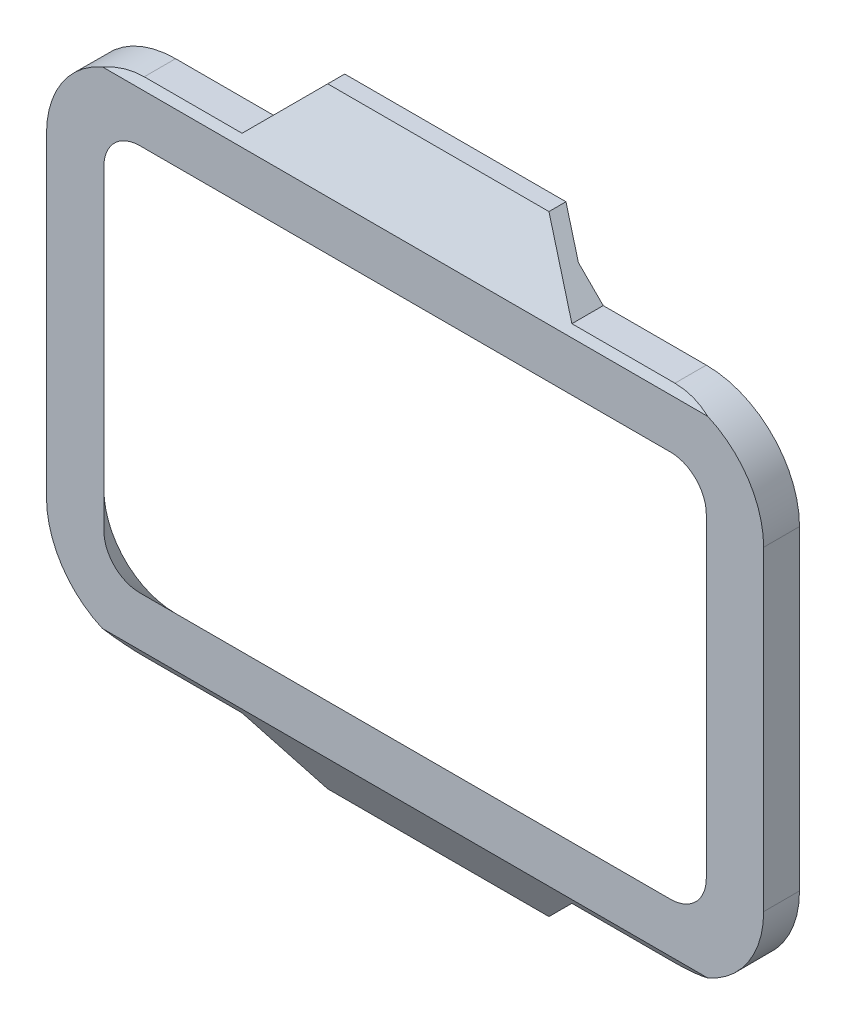
ISO-10303-21;
HEADER;
FILE_DESCRIPTION(('STEP AP214'),'2;1');
FILE_NAME('part.step','',(''),(''),'','','');
FILE_SCHEMA(('AUTOMOTIVE_DESIGN { 1 0 10303 214 1 1 1 1 }'));
ENDSEC;
DATA;
#1=APPLICATION_CONTEXT('core data for automotive mechanical design processes');
#2=APPLICATION_PROTOCOL_DEFINITION('international standard','automotive_design',2000,#1);
#3=PRODUCT_CONTEXT('',#1,'mechanical');
#4=PRODUCT('Part','Part','',(#3));
#5=PRODUCT_RELATED_PRODUCT_CATEGORY('part','',(#4));
#6=PRODUCT_DEFINITION_FORMATION('','',#4);
#7=PRODUCT_DEFINITION_CONTEXT('part definition',#1,'design');
#8=PRODUCT_DEFINITION('design','',#6,#7);
#9=PRODUCT_DEFINITION_SHAPE('','',#8);
#10=(LENGTH_UNIT() NAMED_UNIT(*) SI_UNIT(.MILLI.,.METRE.));
#11=(NAMED_UNIT(*) PLANE_ANGLE_UNIT() SI_UNIT($,.RADIAN.));
#12=(NAMED_UNIT(*) SI_UNIT($,.STERADIAN.) SOLID_ANGLE_UNIT());
#13=UNCERTAINTY_MEASURE_WITH_UNIT(LENGTH_MEASURE(1.E-05),#10,'distance_accuracy_value','');
#14=(GEOMETRIC_REPRESENTATION_CONTEXT(3) GLOBAL_UNCERTAINTY_ASSIGNED_CONTEXT((#13)) GLOBAL_UNIT_ASSIGNED_CONTEXT((#10,
#11,#12)) REPRESENTATION_CONTEXT('',''));
#15=CARTESIAN_POINT('',(0.,0.,0.));
#16=DIRECTION('',(0.,0.,1.));
#17=DIRECTION('',(1.,0.,0.));
#18=AXIS2_PLACEMENT_3D('',#15,#16,#17);
#19=CARTESIAN_POINT('',(0.,-88.0986851236343,-5.));
#20=DIRECTION('',(0.,-1.,0.));
#21=DIRECTION('',(0.,0.,-1.));
#22=AXIS2_PLACEMENT_3D('',#19,#20,#21);
#23=PLANE('',#22);
#24=DIRECTION('',(0.,0.,1.));
#25=VECTOR('',#24,1.);
#26=CARTESIAN_POINT('',(45.0115613829762,-88.0986851236343,-5.));
#27=LINE('',#26,#25);
#28=CARTESIAN_POINT('',(45.0115613829762,-88.0986851236343,-5.));
#29=VERTEX_POINT('',#28);
#30=CARTESIAN_POINT('',(45.0115613829762,-88.0986851236343,-0.628851162176113));
#31=VERTEX_POINT('',#30);
#32=EDGE_CURVE('E325',#29,#31,#27,.T.);
#33=ORIENTED_EDGE('',*,*,#32,.T.);
#34=DIRECTION('',(-1.,0.,0.));
#35=VECTOR('',#34,1.);
#36=CARTESIAN_POINT('',(0.,-88.0986851236343,-0.628851162176109));
#37=LINE('',#36,#35);
#38=CARTESIAN_POINT('',(30.6444252788379,-88.0986851236343,-0.628851162176112));
#39=VERTEX_POINT('',#38);
#40=EDGE_CURVE('E48',#31,#39,#37,.T.);
#41=ORIENTED_EDGE('',*,*,#40,.T.);
#42=DIRECTION('',(0.,0.,1.));
#43=VECTOR('',#42,1.);
#44=CARTESIAN_POINT('',(30.6444252788379,-88.0986851236343,-8.));
#45=LINE('',#44,#43);
#46=CARTESIAN_POINT('',(30.6444252788379,-88.0986851236343,-5.));
#47=VERTEX_POINT('',#46);
#48=EDGE_CURVE('E223',#47,#39,#45,.T.);
#49=ORIENTED_EDGE('',*,*,#48,.F.);
#50=DIRECTION('',(1.,0.,0.));
#51=VECTOR('',#50,1.);
#52=CARTESIAN_POINT('',(0.,-88.0986851236343,-5.));
#53=LINE('',#52,#51);
#54=EDGE_CURVE('E233',#47,#29,#53,.T.);
#55=ORIENTED_EDGE('',*,*,#54,.T.);
#56=EDGE_LOOP('',(#33,#41,#49,#55));
#57=FACE_BOUND('',#56,.T.);
#58=ADVANCED_FACE('F38',(#57),#23,.T.);
#59=DIRECTION('',(0.,0.,1.));
#60=VECTOR('',#59,1.);
#61=CARTESIAN_POINT('',(-15.345428915665,-88.0986851236343,-8.));
#62=LINE('',#61,#60);
#63=CARTESIAN_POINT('',(-15.345428915665,-88.0986851236343,-5.));
#64=VERTEX_POINT('',#63);
#65=CARTESIAN_POINT('',(-15.345428915665,-88.0986851236343,-0.628851162176108));
#66=VERTEX_POINT('',#65);
#67=EDGE_CURVE('E436',#64,#66,#62,.T.);
#68=ORIENTED_EDGE('',*,*,#67,.T.);
#69=DIRECTION('',(-1.,0.,0.));
#70=VECTOR('',#69,1.);
#71=CARTESIAN_POINT('',(0.,-88.0986851236343,-0.628851162176109));
#72=LINE('',#71,#70);
#73=CARTESIAN_POINT('',(-28.9884386170237,-88.0986851236343,-0.628851162176106));
#74=VERTEX_POINT('',#73);
#75=EDGE_CURVE('E414',#66,#74,#72,.T.);
#76=ORIENTED_EDGE('',*,*,#75,.T.);
#77=DIRECTION('',(0.,0.,1.));
#78=VECTOR('',#77,1.);
#79=CARTESIAN_POINT('',(-28.9884386170237,-88.0986851236343,-5.));
#80=LINE('',#79,#78);
#81=CARTESIAN_POINT('',(-28.9884386170237,-88.0986851236343,-5.));
#82=VERTEX_POINT('',#81);
#83=EDGE_CURVE('E327',#82,#74,#80,.T.);
#84=ORIENTED_EDGE('',*,*,#83,.F.);
#85=EDGE_CURVE('E245',#82,#64,#53,.T.);
#86=ORIENTED_EDGE('',*,*,#85,.T.);
#87=EDGE_LOOP('',(#68,#76,#84,#86));
#88=FACE_BOUND('',#87,.T.);
#89=ADVANCED_FACE('F505',(#88),#23,.T.);
#90=CARTESIAN_POINT('',(0.,-18.0986851236343,-5.));
#91=DIRECTION('',(0.,1.,0.));
#92=DIRECTION('',(-1.,0.,0.));
#93=AXIS2_PLACEMENT_3D('',#90,#91,#92);
#94=PLANE('',#93);
#95=DIRECTION('',(0.,0.,1.));
#96=VECTOR('',#95,1.);
#97=CARTESIAN_POINT('',(-28.9884386170237,-18.0986851236343,-5.));
#98=LINE('',#97,#96);
#99=CARTESIAN_POINT('',(-28.9884386170237,-18.0986851236343,-5.));
#100=VERTEX_POINT('',#99);
#101=CARTESIAN_POINT('',(-28.9884386170237,-18.0986851236343,-0.628851162176097));
#102=VERTEX_POINT('',#101);
#103=EDGE_CURVE('E314',#100,#102,#98,.T.);
#104=ORIENTED_EDGE('',*,*,#103,.T.);
#105=DIRECTION('',(-1.,0.,0.));
#106=VECTOR('',#105,1.);
#107=CARTESIAN_POINT('',(0.,-18.0986851236343,-0.628851162176101));
#108=LINE('',#107,#106);
#109=CARTESIAN_POINT('',(-15.345428915665,-18.0986851236343,-0.628851162176099));
#110=VERTEX_POINT('',#109);
#111=EDGE_CURVE('E392',#102,#110,#108,.F.);
#112=ORIENTED_EDGE('',*,*,#111,.T.);
#113=DIRECTION('',(0.,0.,1.));
#114=VECTOR('',#113,1.);
#115=CARTESIAN_POINT('',(-15.345428915665,-18.0986851236343,-8.));
#116=LINE('',#115,#114);
#117=CARTESIAN_POINT('',(-15.345428915665,-18.0986851236343,-5.));
#118=VERTEX_POINT('',#117);
#119=EDGE_CURVE('E351',#118,#110,#116,.T.);
#120=ORIENTED_EDGE('',*,*,#119,.F.);
#121=DIRECTION('',(-1.,0.,0.));
#122=VECTOR('',#121,1.);
#123=CARTESIAN_POINT('',(0.,-18.0986851236343,-5.));
#124=LINE('',#123,#122);
#125=EDGE_CURVE('E261',#118,#100,#124,.T.);
#126=ORIENTED_EDGE('',*,*,#125,.T.);
#127=EDGE_LOOP('',(#104,#112,#120,#126));
#128=FACE_BOUND('',#127,.T.);
#129=ADVANCED_FACE('F464',(#128),#94,.T.);
#130=CARTESIAN_POINT('',(-41.9884386170237,0.,-5.));
#131=DIRECTION('',(-1.,0.,0.));
#132=DIRECTION('',(0.,0.,1.));
#133=AXIS2_PLACEMENT_3D('',#130,#131,#132);
#134=PLANE('',#133);
#135=DIRECTION('',(0.,-1.,0.));
#136=VECTOR('',#135,1.);
#137=CARTESIAN_POINT('',(-41.9884386170237,0.,0.));
#138=LINE('',#137,#136);
#139=CARTESIAN_POINT('',(-41.9884386170237,-31.0986851236343,0.));
#140=VERTEX_POINT('',#139);
#141=CARTESIAN_POINT('',(-41.9884386170237,-75.0986851236343,0.));
#142=VERTEX_POINT('',#141);
#143=EDGE_CURVE('E294',#140,#142,#138,.T.);
#144=ORIENTED_EDGE('',*,*,#143,.F.);
#145=DIRECTION('',(0.,0.,1.));
#146=VECTOR('',#145,1.);
#147=CARTESIAN_POINT('',(-41.9884386170237,-31.0986851236343,-5.));
#148=LINE('',#147,#146);
#149=CARTESIAN_POINT('',(-41.9884386170237,-31.0986851236343,-5.));
#150=VERTEX_POINT('',#149);
#151=EDGE_CURVE('E310',#150,#140,#148,.T.);
#152=ORIENTED_EDGE('',*,*,#151,.F.);
#153=DIRECTION('',(0.,-1.,0.));
#154=VECTOR('',#153,1.);
#155=CARTESIAN_POINT('',(-41.9884386170237,0.,-5.));
#156=LINE('',#155,#154);
#157=CARTESIAN_POINT('',(-41.9884386170237,-75.0986851236343,-5.));
#158=VERTEX_POINT('',#157);
#159=EDGE_CURVE('E250',#150,#158,#156,.T.);
#160=ORIENTED_EDGE('',*,*,#159,.T.);
#161=DIRECTION('',(0.,0.,1.));
#162=VECTOR('',#161,1.);
#163=CARTESIAN_POINT('',(-41.9884386170237,-75.0986851236343,-5.));
#164=LINE('',#163,#162);
#165=EDGE_CURVE('E268',#158,#142,#164,.T.);
#166=ORIENTED_EDGE('',*,*,#165,.T.);
#167=EDGE_LOOP('',(#144,#152,#160,#166));
#168=FACE_BOUND('',#167,.T.);
#169=ADVANCED_FACE('F453',(#168),#134,.T.);
#170=CARTESIAN_POINT('',(-28.9884386170237,-31.0986851236343,-5.));
#171=DIRECTION('',(0.,0.,1.));
#172=DIRECTION('',(1.,0.,0.));
#173=AXIS2_PLACEMENT_3D('',#170,#171,#172);
#174=CYLINDRICAL_SURFACE('',#173,13.);
#175=CARTESIAN_POINT('',(-28.9884386170237,-31.0986851236343,0.));
#176=DIRECTION('',(0.,0.,1.));
#177=DIRECTION('',(1.,0.,0.));
#178=AXIS2_PLACEMENT_3D('',#175,#176,#177);
#179=CIRCLE('',#178,13.);
#180=CARTESIAN_POINT('',(-34.1973631598608,-19.1878872869221,0.));
#181=VERTEX_POINT('',#180);
#182=EDGE_CURVE('E308',#181,#140,#179,.T.);
#183=ORIENTED_EDGE('',*,*,#182,.F.);
#184=CARTESIAN_POINT('',(-28.9884386170237,-31.0986851236343,6.87670233728906));
#185=DIRECTION('',(0.,-0.500000000000001,-0.866025403784438));
#186=DIRECTION('',(0.,-0.866025403784438,0.500000000000001));
#187=AXIS2_PLACEMENT_3D('',#184,#185,#186);
#188=ELLIPSE('',#187,15.0111069989303,13.);
#189=EDGE_CURVE('E390',#181,#102,#188,.T.);
#190=ORIENTED_EDGE('',*,*,#189,.T.);
#191=ORIENTED_EDGE('',*,*,#103,.F.);
#192=CARTESIAN_POINT('',(-28.9884386170237,-31.0986851236343,-5.));
#193=DIRECTION('',(0.,0.,1.));
#194=DIRECTION('',(1.,0.,0.));
#195=AXIS2_PLACEMENT_3D('',#192,#193,#194);
#196=CIRCLE('',#195,13.);
#197=EDGE_CURVE('E265',#100,#150,#196,.T.);
#198=ORIENTED_EDGE('',*,*,#197,.T.);
#199=ORIENTED_EDGE('',*,*,#151,.T.);
#200=EDGE_LOOP('',(#183,#190,#191,#198,#199));
#201=FACE_BOUND('',#200,.T.);
#202=ADVANCED_FACE('F461',(#201),#174,.T.);
#203=DIRECTION('',(0.,0.,1.));
#204=VECTOR('',#203,1.);
#205=CARTESIAN_POINT('',(30.6444252788379,-18.0986851236343,-8.));
#206=LINE('',#205,#204);
#207=CARTESIAN_POINT('',(30.6444252788379,-18.0986851236343,-5.));
#208=VERTEX_POINT('',#207);
#209=CARTESIAN_POINT('',(30.6444252788379,-18.0986851236343,-0.628851162176105));
#210=VERTEX_POINT('',#209);
#211=EDGE_CURVE('E236',#208,#210,#206,.T.);
#212=ORIENTED_EDGE('',*,*,#211,.T.);
#213=DIRECTION('',(-1.,0.,0.));
#214=VECTOR('',#213,1.);
#215=CARTESIAN_POINT('',(0.,-18.0986851236343,-0.628851162176101));
#216=LINE('',#215,#214);
#217=CARTESIAN_POINT('',(45.0115613829763,-18.0986851236343,-0.628851162176105));
#218=VERTEX_POINT('',#217);
#219=EDGE_CURVE('E394',#210,#218,#216,.F.);
#220=ORIENTED_EDGE('',*,*,#219,.T.);
#221=DIRECTION('',(0.,0.,1.));
#222=VECTOR('',#221,1.);
#223=CARTESIAN_POINT('',(45.0115613829763,-18.0986851236343,-5.));
#224=LINE('',#223,#222);
#225=CARTESIAN_POINT('',(45.0115613829763,-18.0986851236343,-5.));
#226=VERTEX_POINT('',#225);
#227=EDGE_CURVE('E317',#226,#218,#224,.T.);
#228=ORIENTED_EDGE('',*,*,#227,.F.);
#229=EDGE_CURVE('E262',#226,#208,#124,.T.);
#230=ORIENTED_EDGE('',*,*,#229,.T.);
#231=EDGE_LOOP('',(#212,#220,#228,#230));
#232=FACE_BOUND('',#231,.T.);
#233=ADVANCED_FACE('F489',(#232),#94,.T.);
#234=CARTESIAN_POINT('',(45.0115613829762,-31.0986851236343,-5.));
#235=DIRECTION('',(0.,0.,1.));
#236=DIRECTION('',(1.,0.,0.));
#237=AXIS2_PLACEMENT_3D('',#234,#235,#236);
#238=CYLINDRICAL_SURFACE('',#237,13.);
#239=ORIENTED_EDGE('',*,*,#227,.T.);
#240=CARTESIAN_POINT('',(45.0115613829762,-31.0986851236343,6.87670233728907));
#241=DIRECTION('',(0.,-0.500000000000001,-0.866025403784438));
#242=DIRECTION('',(0.,-0.866025403784438,0.500000000000001));
#243=AXIS2_PLACEMENT_3D('',#240,#241,#242);
#244=ELLIPSE('',#243,15.0111069989303,13.);
#245=CARTESIAN_POINT('',(50.2204859258133,-19.1878872869221,0.));
#246=VERTEX_POINT('',#245);
#247=EDGE_CURVE('E396',#218,#246,#244,.T.);
#248=ORIENTED_EDGE('',*,*,#247,.T.);
#249=CARTESIAN_POINT('',(45.0115613829762,-31.0986851236343,0.));
#250=DIRECTION('',(0.,0.,1.));
#251=DIRECTION('',(1.,0.,0.));
#252=AXIS2_PLACEMENT_3D('',#249,#250,#251);
#253=CIRCLE('',#252,13.);
#254=CARTESIAN_POINT('',(58.0115613829763,-31.0986851236343,0.));
#255=VERTEX_POINT('',#254);
#256=EDGE_CURVE('E305',#255,#246,#253,.T.);
#257=ORIENTED_EDGE('',*,*,#256,.F.);
#258=DIRECTION('',(0.,0.,1.));
#259=VECTOR('',#258,1.);
#260=CARTESIAN_POINT('',(58.0115613829763,-31.0986851236343,-5.));
#261=LINE('',#260,#259);
#262=CARTESIAN_POINT('',(58.0115613829763,-31.0986851236343,-5.));
#263=VERTEX_POINT('',#262);
#264=EDGE_CURVE('E320',#263,#255,#261,.T.);
#265=ORIENTED_EDGE('',*,*,#264,.F.);
#266=CARTESIAN_POINT('',(45.0115613829762,-31.0986851236343,-5.));
#267=DIRECTION('',(0.,0.,1.));
#268=DIRECTION('',(1.,0.,0.));
#269=AXIS2_PLACEMENT_3D('',#266,#267,#268);
#270=CIRCLE('',#269,13.);
#271=EDGE_CURVE('E258',#263,#226,#270,.T.);
#272=ORIENTED_EDGE('',*,*,#271,.T.);
#273=EDGE_LOOP('',(#239,#248,#257,#265,#272));
#274=FACE_BOUND('',#273,.T.);
#275=ADVANCED_FACE('F492',(#274),#238,.T.);
#276=CARTESIAN_POINT('',(58.0115613829763,0.,-5.));
#277=DIRECTION('',(1.,0.,0.));
#278=DIRECTION('',(0.,0.,-1.));
#279=AXIS2_PLACEMENT_3D('',#276,#277,#278);
#280=PLANE('',#279);
#281=DIRECTION('',(0.,1.,0.));
#282=VECTOR('',#281,1.);
#283=CARTESIAN_POINT('',(58.0115613829763,0.,0.));
#284=LINE('',#283,#282);
#285=CARTESIAN_POINT('',(58.0115613829763,-75.0986851236343,0.));
#286=VERTEX_POINT('',#285);
#287=EDGE_CURVE('E302',#286,#255,#284,.T.);
#288=ORIENTED_EDGE('',*,*,#287,.F.);
#289=DIRECTION('',(0.,0.,1.));
#290=VECTOR('',#289,1.);
#291=CARTESIAN_POINT('',(58.0115613829763,-75.0986851236343,-5.));
#292=LINE('',#291,#290);
#293=CARTESIAN_POINT('',(58.0115613829763,-75.0986851236343,-5.));
#294=VERTEX_POINT('',#293);
#295=EDGE_CURVE('E322',#294,#286,#292,.T.);
#296=ORIENTED_EDGE('',*,*,#295,.F.);
#297=DIRECTION('',(0.,1.,0.));
#298=VECTOR('',#297,1.);
#299=CARTESIAN_POINT('',(58.0115613829763,0.,-5.));
#300=LINE('',#299,#298);
#301=EDGE_CURVE('E255',#294,#263,#300,.T.);
#302=ORIENTED_EDGE('',*,*,#301,.T.);
#303=ORIENTED_EDGE('',*,*,#264,.T.);
#304=EDGE_LOOP('',(#288,#296,#302,#303));
#305=FACE_BOUND('',#304,.T.);
#306=ADVANCED_FACE('F497',(#305),#280,.T.);
#307=CARTESIAN_POINT('',(45.0115613829762,-75.0986851236343,-5.));
#308=DIRECTION('',(0.,0.,1.));
#309=DIRECTION('',(1.,0.,0.));
#310=AXIS2_PLACEMENT_3D('',#307,#308,#309);
#311=CYLINDRICAL_SURFACE('',#310,13.);
#312=CARTESIAN_POINT('',(45.0115613829762,-75.0986851236343,0.));
#313=DIRECTION('',(0.,0.,1.));
#314=DIRECTION('',(1.,0.,0.));
#315=AXIS2_PLACEMENT_3D('',#312,#313,#314);
#316=CIRCLE('',#315,13.);
#317=CARTESIAN_POINT('',(50.2204859258134,-87.0094829603465,0.));
#318=VERTEX_POINT('',#317);
#319=EDGE_CURVE('E300',#318,#286,#316,.T.);
#320=ORIENTED_EDGE('',*,*,#319,.F.);
#321=CARTESIAN_POINT('',(45.0115613829762,-75.0986851236343,6.87670233728904));
#322=DIRECTION('',(0.,-0.500000000000001,0.866025403784438));
#323=DIRECTION('',(0.,0.866025403784438,0.500000000000001));
#324=AXIS2_PLACEMENT_3D('',#321,#322,#323);
#325=ELLIPSE('',#324,15.0111069989303,13.);
#326=EDGE_CURVE('E420',#318,#31,#325,.F.);
#327=ORIENTED_EDGE('',*,*,#326,.T.);
#328=ORIENTED_EDGE('',*,*,#32,.F.);
#329=CARTESIAN_POINT('',(45.0115613829762,-75.0986851236343,-5.));
#330=DIRECTION('',(0.,0.,1.));
#331=DIRECTION('',(1.,0.,0.));
#332=AXIS2_PLACEMENT_3D('',#329,#330,#331);
#333=CIRCLE('',#332,13.);
#334=EDGE_CURVE('E244',#29,#294,#333,.T.);
#335=ORIENTED_EDGE('',*,*,#334,.T.);
#336=ORIENTED_EDGE('',*,*,#295,.T.);
#337=EDGE_LOOP('',(#320,#327,#328,#335,#336));
#338=FACE_BOUND('',#337,.T.);
#339=ADVANCED_FACE('F424',(#338),#311,.T.);
#340=CARTESIAN_POINT('',(-28.9884386170237,-75.0986851236343,-5.));
#341=DIRECTION('',(0.,0.,1.));
#342=DIRECTION('',(1.,0.,0.));
#343=AXIS2_PLACEMENT_3D('',#340,#341,#342);
#344=CYLINDRICAL_SURFACE('',#343,13.);
#345=ORIENTED_EDGE('',*,*,#83,.T.);
#346=CARTESIAN_POINT('',(-28.9884386170237,-75.0986851236343,6.87670233728904));
#347=DIRECTION('',(0.,-0.500000000000001,0.866025403784438));
#348=DIRECTION('',(0.,0.866025403784438,0.500000000000001));
#349=AXIS2_PLACEMENT_3D('',#346,#347,#348);
#350=ELLIPSE('',#349,15.0111069989303,13.);
#351=CARTESIAN_POINT('',(-34.1973631598608,-87.0094829603466,0.));
#352=VERTEX_POINT('',#351);
#353=EDGE_CURVE('E416',#74,#352,#350,.F.);
#354=ORIENTED_EDGE('',*,*,#353,.T.);
#355=CARTESIAN_POINT('',(-28.9884386170237,-75.0986851236343,0.));
#356=DIRECTION('',(0.,0.,1.));
#357=DIRECTION('',(1.,0.,0.));
#358=AXIS2_PLACEMENT_3D('',#355,#356,#357);
#359=CIRCLE('',#358,13.);
#360=EDGE_CURVE('E297',#142,#352,#359,.T.);
#361=ORIENTED_EDGE('',*,*,#360,.F.);
#362=ORIENTED_EDGE('',*,*,#165,.F.);
#363=CARTESIAN_POINT('',(-28.9884386170237,-75.0986851236343,-5.));
#364=DIRECTION('',(0.,0.,1.));
#365=DIRECTION('',(1.,0.,0.));
#366=AXIS2_PLACEMENT_3D('',#363,#364,#365);
#367=CIRCLE('',#366,13.);
#368=EDGE_CURVE('E246',#158,#82,#367,.T.);
#369=ORIENTED_EDGE('',*,*,#368,.T.);
#370=EDGE_LOOP('',(#345,#354,#361,#362,#369));
#371=FACE_BOUND('',#370,.T.);
#372=ADVANCED_FACE('F503',(#371),#344,.T.);
#373=CARTESIAN_POINT('',(0.,0.,-5.));
#374=DIRECTION('',(0.,0.,1.));
#375=DIRECTION('',(1.,0.,0.));
#376=AXIS2_PLACEMENT_3D('',#373,#374,#375);
#377=PLANE('',#376);
#378=CARTESIAN_POINT('',(-28.9884386170237,-75.0986851236343,-5.));
#379=DIRECTION('',(0.,0.,1.));
#380=DIRECTION('',(1.,0.,0.));
#381=AXIS2_PLACEMENT_3D('',#378,#379,#380);
#382=CIRCLE('',#381,9.99999999999998);
#383=CARTESIAN_POINT('',(-38.9884386170237,-75.0986851236343,-5.));
#384=VERTEX_POINT('',#383);
#385=CARTESIAN_POINT('',(-28.9884386170237,-85.0986851236343,-5.));
#386=VERTEX_POINT('',#385);
#387=EDGE_CURVE('E340',#384,#386,#382,.T.);
#388=ORIENTED_EDGE('',*,*,#387,.T.);
#389=DIRECTION('',(1.,0.,0.));
#390=VECTOR('',#389,1.);
#391=CARTESIAN_POINT('',(0.,-85.0986851236343,-5.));
#392=LINE('',#391,#390);
#393=CARTESIAN_POINT('',(45.0115613829762,-85.0986851236343,-5.));
#394=VERTEX_POINT('',#393);
#395=EDGE_CURVE('E344',#386,#394,#392,.T.);
#396=ORIENTED_EDGE('',*,*,#395,.T.);
#397=CARTESIAN_POINT('',(45.0115613829762,-75.0986851236343,-5.));
#398=DIRECTION('',(0.,0.,1.));
#399=DIRECTION('',(1.,0.,0.));
#400=AXIS2_PLACEMENT_3D('',#397,#398,#399);
#401=CIRCLE('',#400,9.99999999999999);
#402=CARTESIAN_POINT('',(55.0115613829762,-75.0986851236343,-5.));
#403=VERTEX_POINT('',#402);
#404=EDGE_CURVE('E342',#394,#403,#401,.T.);
#405=ORIENTED_EDGE('',*,*,#404,.T.);
#406=DIRECTION('',(0.,1.,0.));
#407=VECTOR('',#406,1.);
#408=CARTESIAN_POINT('',(55.0115613829762,0.,-5.));
#409=LINE('',#408,#407);
#410=CARTESIAN_POINT('',(55.0115613829762,-31.0986851236343,-5.));
#411=VERTEX_POINT('',#410);
#412=EDGE_CURVE('E338',#403,#411,#409,.T.);
#413=ORIENTED_EDGE('',*,*,#412,.T.);
#414=CARTESIAN_POINT('',(45.0115613829762,-31.0986851236343,-5.));
#415=DIRECTION('',(0.,0.,1.));
#416=DIRECTION('',(1.,0.,0.));
#417=AXIS2_PLACEMENT_3D('',#414,#415,#416);
#418=CIRCLE('',#417,10.);
#419=CARTESIAN_POINT('',(45.0115613829762,-21.0986851236343,-5.));
#420=VERTEX_POINT('',#419);
#421=EDGE_CURVE('E334',#411,#420,#418,.T.);
#422=ORIENTED_EDGE('',*,*,#421,.T.);
#423=DIRECTION('',(-1.,0.,0.));
#424=VECTOR('',#423,1.);
#425=CARTESIAN_POINT('',(0.,-21.0986851236343,-5.));
#426=LINE('',#425,#424);
#427=CARTESIAN_POINT('',(-28.9884386170237,-21.0986851236343,-5.));
#428=VERTEX_POINT('',#427);
#429=EDGE_CURVE('E313',#420,#428,#426,.T.);
#430=ORIENTED_EDGE('',*,*,#429,.T.);
#431=CARTESIAN_POINT('',(-28.9884386170237,-31.0986851236343,-5.));
#432=DIRECTION('',(0.,0.,1.));
#433=DIRECTION('',(1.,0.,0.));
#434=AXIS2_PLACEMENT_3D('',#431,#432,#433);
#435=CIRCLE('',#434,9.99999999999999);
#436=CARTESIAN_POINT('',(-38.9884386170237,-31.0986851236343,-5.));
#437=VERTEX_POINT('',#436);
#438=EDGE_CURVE('E332',#428,#437,#435,.T.);
#439=ORIENTED_EDGE('',*,*,#438,.T.);
#440=DIRECTION('',(0.,-1.,0.));
#441=VECTOR('',#440,1.);
#442=CARTESIAN_POINT('',(-38.9884386170237,0.,-5.));
#443=LINE('',#442,#441);
#444=EDGE_CURVE('E336',#437,#384,#443,.T.);
#445=ORIENTED_EDGE('',*,*,#444,.T.);
#446=EDGE_LOOP('',(#388,#396,#405,#413,#422,#430,#439,#445));
#447=FACE_BOUND('',#446,.T.);
#448=ORIENTED_EDGE('',*,*,#159,.F.);
#449=ORIENTED_EDGE('',*,*,#197,.F.);
#450=ORIENTED_EDGE('',*,*,#125,.F.);
#451=DIRECTION('',(-0.707106781186551,-0.707106781186544,0.));
#452=VECTOR('',#451,1.);
#453=CARTESIAN_POINT('',(1.37662810398473,-1.37662810398474,-5.));
#454=LINE('',#453,#452);
#455=CARTESIAN_POINT('',(-11.8813273005271,-14.6345835084964,-5.));
#456=VERTEX_POINT('',#455);
#457=EDGE_CURVE('E381',#456,#118,#454,.T.);
#458=ORIENTED_EDGE('',*,*,#457,.F.);
#459=DIRECTION('',(-1.,0.,0.));
#460=VECTOR('',#459,1.);
#461=CARTESIAN_POINT('',(0.,-14.6345835084964,-5.));
#462=LINE('',#461,#460);
#463=CARTESIAN_POINT('',(27.1803236637,-14.6345835084964,-5.));
#464=VERTEX_POINT('',#463);
#465=EDGE_CURVE('E398',#456,#464,#462,.F.);
#466=ORIENTED_EDGE('',*,*,#465,.T.);
#467=DIRECTION('',(-0.707106781186552,0.707106781186543,0.));
#468=VECTOR('',#467,1.);
#469=CARTESIAN_POINT('',(6.27287007760161,6.27287007760168,-5.));
#470=LINE('',#469,#468);
#471=EDGE_CURVE('E373',#208,#464,#470,.T.);
#472=ORIENTED_EDGE('',*,*,#471,.F.);
#473=ORIENTED_EDGE('',*,*,#229,.F.);
#474=ORIENTED_EDGE('',*,*,#271,.F.);
#475=ORIENTED_EDGE('',*,*,#301,.F.);
#476=ORIENTED_EDGE('',*,*,#334,.F.);
#477=ORIENTED_EDGE('',*,*,#54,.F.);
#478=DIRECTION('',(0.707106781186552,0.707106781186544,0.));
#479=VECTOR('',#478,1.);
#480=CARTESIAN_POINT('',(23.0733734042812,-95.669736998191,-5.));
#481=LINE('',#480,#479);
#482=CARTESIAN_POINT('',(27.1803236637,-91.5627867387722,-5.));
#483=VERTEX_POINT('',#482);
#484=EDGE_CURVE('E220',#483,#47,#481,.T.);
#485=ORIENTED_EDGE('',*,*,#484,.F.);
#486=DIRECTION('',(-1.,0.,0.));
#487=VECTOR('',#486,1.);
#488=CARTESIAN_POINT('',(0.,-91.5627867387722,-5.));
#489=LINE('',#488,#487);
#490=CARTESIAN_POINT('',(-11.8813273005271,-91.5627867387722,-5.));
#491=VERTEX_POINT('',#490);
#492=EDGE_CURVE('E11',#483,#491,#489,.T.);
#493=ORIENTED_EDGE('',*,*,#492,.T.);
#494=DIRECTION('',(0.707106781186551,-0.707106781186544,0.));
#495=VECTOR('',#494,1.);
#496=CARTESIAN_POINT('',(-15.345428915665,-88.0986851236343,-5.));
#497=LINE('',#496,#495);
#498=EDGE_CURVE('E54',#64,#491,#497,.T.);
#499=ORIENTED_EDGE('',*,*,#498,.F.);
#500=ORIENTED_EDGE('',*,*,#85,.F.);
#501=ORIENTED_EDGE('',*,*,#368,.F.);
#502=EDGE_LOOP('',(#448,#449,#450,#458,#466,#472,#473,#474,#475,#476,#477,#485,#493,#499,#500,#501));
#503=FACE_BOUND('',#502,.T.);
#504=ADVANCED_FACE('F241',(#447,#503),#377,.F.);
#505=CARTESIAN_POINT('',(0.,0.,0.));
#506=DIRECTION('',(0.,0.,1.));
#507=DIRECTION('',(1.,0.,0.));
#508=AXIS2_PLACEMENT_3D('',#505,#506,#507);
#509=PLANE('',#508);
#510=CARTESIAN_POINT('',(-28.9884386170237,-75.0986851236343,0.));
#511=DIRECTION('',(0.,0.,1.));
#512=DIRECTION('',(1.,0.,0.));
#513=AXIS2_PLACEMENT_3D('',#510,#511,#512);
#514=CIRCLE('',#513,5.);
#515=CARTESIAN_POINT('',(-33.9884386170237,-75.0986851236343,0.));
#516=VERTEX_POINT('',#515);
#517=CARTESIAN_POINT('',(-28.9884386170237,-80.0986851236343,0.));
#518=VERTEX_POINT('',#517);
#519=EDGE_CURVE('E269',#516,#518,#514,.T.);
#520=ORIENTED_EDGE('',*,*,#519,.F.);
#521=DIRECTION('',(0.,-1.,0.));
#522=VECTOR('',#521,1.);
#523=CARTESIAN_POINT('',(-33.9884386170237,0.,0.));
#524=LINE('',#523,#522);
#525=CARTESIAN_POINT('',(-33.9884386170237,-31.0986851236343,0.));
#526=VERTEX_POINT('',#525);
#527=EDGE_CURVE('E272',#526,#516,#524,.T.);
#528=ORIENTED_EDGE('',*,*,#527,.F.);
#529=CARTESIAN_POINT('',(-28.9884386170237,-31.0986851236343,0.));
#530=DIRECTION('',(0.,0.,1.));
#531=DIRECTION('',(1.,0.,0.));
#532=AXIS2_PLACEMENT_3D('',#529,#530,#531);
#533=CIRCLE('',#532,5.00000000000001);
#534=CARTESIAN_POINT('',(-28.9884386170237,-26.0986851236343,0.));
#535=VERTEX_POINT('',#534);
#536=EDGE_CURVE('E276',#535,#526,#533,.T.);
#537=ORIENTED_EDGE('',*,*,#536,.F.);
#538=DIRECTION('',(-1.,0.,0.));
#539=VECTOR('',#538,1.);
#540=CARTESIAN_POINT('',(0.,-26.0986851236343,0.));
#541=LINE('',#540,#539);
#542=CARTESIAN_POINT('',(45.0115613829762,-26.0986851236343,0.));
#543=VERTEX_POINT('',#542);
#544=EDGE_CURVE('E279',#543,#535,#541,.T.);
#545=ORIENTED_EDGE('',*,*,#544,.F.);
#546=CARTESIAN_POINT('',(45.0115613829762,-31.0986851236343,0.));
#547=DIRECTION('',(0.,0.,1.));
#548=DIRECTION('',(1.,0.,0.));
#549=AXIS2_PLACEMENT_3D('',#546,#547,#548);
#550=CIRCLE('',#549,5.00000000000002);
#551=CARTESIAN_POINT('',(50.0115613829763,-31.0986851236343,0.));
#552=VERTEX_POINT('',#551);
#553=EDGE_CURVE('E282',#552,#543,#550,.T.);
#554=ORIENTED_EDGE('',*,*,#553,.F.);
#555=DIRECTION('',(0.,1.,0.));
#556=VECTOR('',#555,1.);
#557=CARTESIAN_POINT('',(50.0115613829763,0.,0.));
#558=LINE('',#557,#556);
#559=CARTESIAN_POINT('',(50.0115613829762,-75.0986851236343,0.));
#560=VERTEX_POINT('',#559);
#561=EDGE_CURVE('E285',#560,#552,#558,.T.);
#562=ORIENTED_EDGE('',*,*,#561,.F.);
#563=CARTESIAN_POINT('',(45.0115613829762,-75.0986851236343,0.));
#564=DIRECTION('',(0.,0.,1.));
#565=DIRECTION('',(1.,0.,0.));
#566=AXIS2_PLACEMENT_3D('',#563,#564,#565);
#567=CIRCLE('',#566,5.);
#568=CARTESIAN_POINT('',(45.0115613829762,-80.0986851236343,0.));
#569=VERTEX_POINT('',#568);
#570=EDGE_CURVE('E288',#569,#560,#567,.T.);
#571=ORIENTED_EDGE('',*,*,#570,.F.);
#572=DIRECTION('',(1.,0.,0.));
#573=VECTOR('',#572,1.);
#574=CARTESIAN_POINT('',(0.,-80.0986851236343,0.));
#575=LINE('',#574,#573);
#576=EDGE_CURVE('E291',#518,#569,#575,.T.);
#577=ORIENTED_EDGE('',*,*,#576,.F.);
#578=EDGE_LOOP('',(#520,#528,#537,#545,#554,#562,#571,#577));
#579=FACE_BOUND('',#578,.T.);
#580=ORIENTED_EDGE('',*,*,#360,.T.);
#581=DIRECTION('',(1.,0.,0.));
#582=VECTOR('',#581,1.);
#583=CARTESIAN_POINT('',(23.0733734042812,-87.0094829603465,0.));
#584=LINE('',#583,#582);
#585=EDGE_CURVE('E418',#352,#318,#584,.T.);
#586=ORIENTED_EDGE('',*,*,#585,.T.);
#587=ORIENTED_EDGE('',*,*,#319,.T.);
#588=ORIENTED_EDGE('',*,*,#287,.T.);
#589=ORIENTED_EDGE('',*,*,#256,.T.);
#590=DIRECTION('',(-1.,0.,0.));
#591=VECTOR('',#590,1.);
#592=CARTESIAN_POINT('',(0.,-19.1878872869221,0.));
#593=LINE('',#592,#591);
#594=EDGE_CURVE('E387',#246,#181,#593,.T.);
#595=ORIENTED_EDGE('',*,*,#594,.T.);
#596=ORIENTED_EDGE('',*,*,#182,.T.);
#597=ORIENTED_EDGE('',*,*,#143,.T.);
#598=EDGE_LOOP('',(#580,#586,#587,#588,#589,#595,#596,#597));
#599=FACE_BOUND('',#598,.T.);
#600=ADVANCED_FACE('F499',(#579,#599),#509,.T.);
#601=CARTESIAN_POINT('',(0.,-21.0986851236343,-5.));
#602=DIRECTION('',(0.,0.707106781186547,0.707106781186547));
#603=DIRECTION('',(-1.,0.,0.));
#604=AXIS2_PLACEMENT_3D('',#601,#602,#603);
#605=PLANE('',#604);
#606=DIRECTION('',(0.,0.707106781186547,-0.707106781186547));
#607=VECTOR('',#606,1.);
#608=CARTESIAN_POINT('',(45.0115613829762,-26.0986851236343,0.));
#609=LINE('',#608,#607);
#610=EDGE_CURVE('E365',#543,#420,#609,.T.);
#611=ORIENTED_EDGE('',*,*,#610,.F.);
#612=ORIENTED_EDGE('',*,*,#544,.T.);
#613=DIRECTION('',(0.,-0.707106781186547,0.707106781186547));
#614=VECTOR('',#613,1.);
#615=CARTESIAN_POINT('',(-28.9884386170237,-21.0986851236343,-5.));
#616=LINE('',#615,#614);
#617=EDGE_CURVE('E273',#428,#535,#616,.T.);
#618=ORIENTED_EDGE('',*,*,#617,.F.);
#619=ORIENTED_EDGE('',*,*,#429,.F.);
#620=EDGE_LOOP('',(#611,#612,#618,#619));
#621=FACE_BOUND('',#620,.T.);
#622=ADVANCED_FACE('F581',(#621),#605,.F.);
#623=CARTESIAN_POINT('',(-28.9884386170237,-31.0986851236343,-5.));
#624=DIRECTION('',(0.,0.,-1.));
#625=DIRECTION('',(-1.,0.,0.));
#626=AXIS2_PLACEMENT_3D('',#623,#624,#625);
#627=CONICAL_SURFACE('',#626,9.99999999999999,0.785398163397448);
#628=ORIENTED_EDGE('',*,*,#617,.T.);
#629=ORIENTED_EDGE('',*,*,#536,.T.);
#630=DIRECTION('',(0.707106781186547,0.,0.707106781186547));
#631=VECTOR('',#630,1.);
#632=CARTESIAN_POINT('',(-38.9884386170237,-31.0986851236343,-5.));
#633=LINE('',#632,#631);
#634=EDGE_CURVE('E362',#437,#526,#633,.T.);
#635=ORIENTED_EDGE('',*,*,#634,.F.);
#636=ORIENTED_EDGE('',*,*,#438,.F.);
#637=EDGE_LOOP('',(#628,#629,#635,#636));
#638=FACE_BOUND('',#637,.T.);
#639=ADVANCED_FACE('F574',(#638),#627,.F.);
#640=CARTESIAN_POINT('',(45.0115613829762,-31.0986851236343,-5.));
#641=DIRECTION('',(0.,0.,-1.));
#642=DIRECTION('',(-1.,0.,0.));
#643=AXIS2_PLACEMENT_3D('',#640,#641,#642);
#644=CONICAL_SURFACE('',#643,10.,0.785398163397449);
#645=ORIENTED_EDGE('',*,*,#610,.T.);
#646=ORIENTED_EDGE('',*,*,#421,.F.);
#647=DIRECTION('',(0.707106781186548,0.,-0.707106781186547));
#648=VECTOR('',#647,1.);
#649=CARTESIAN_POINT('',(50.0115613829763,-31.0986851236343,0.));
#650=LINE('',#649,#648);
#651=EDGE_CURVE('E359',#552,#411,#650,.T.);
#652=ORIENTED_EDGE('',*,*,#651,.F.);
#653=ORIENTED_EDGE('',*,*,#553,.T.);
#654=EDGE_LOOP('',(#645,#646,#652,#653));
#655=FACE_BOUND('',#654,.T.);
#656=ADVANCED_FACE('F567',(#655),#644,.F.);
#657=CARTESIAN_POINT('',(-38.9884386170237,0.,-5.));
#658=DIRECTION('',(-0.707106781186547,0.,0.707106781186547));
#659=DIRECTION('',(0.,-1.,0.));
#660=AXIS2_PLACEMENT_3D('',#657,#658,#659);
#661=PLANE('',#660);
#662=ORIENTED_EDGE('',*,*,#634,.T.);
#663=ORIENTED_EDGE('',*,*,#527,.T.);
#664=DIRECTION('',(0.707106781186547,0.,0.707106781186547));
#665=VECTOR('',#664,1.);
#666=CARTESIAN_POINT('',(-38.9884386170237,-75.0986851236343,-5.));
#667=LINE('',#666,#665);
#668=EDGE_CURVE('E356',#384,#516,#667,.T.);
#669=ORIENTED_EDGE('',*,*,#668,.F.);
#670=ORIENTED_EDGE('',*,*,#444,.F.);
#671=EDGE_LOOP('',(#662,#663,#669,#670));
#672=FACE_BOUND('',#671,.T.);
#673=ADVANCED_FACE('F560',(#672),#661,.F.);
#674=CARTESIAN_POINT('',(55.0115613829762,0.,-5.));
#675=DIRECTION('',(0.707106781186547,0.,0.707106781186547));
#676=DIRECTION('',(0.,1.,0.));
#677=AXIS2_PLACEMENT_3D('',#674,#675,#676);
#678=PLANE('',#677);
#679=ORIENTED_EDGE('',*,*,#651,.T.);
#680=ORIENTED_EDGE('',*,*,#412,.F.);
#681=DIRECTION('',(0.707106781186547,0.,-0.707106781186547));
#682=VECTOR('',#681,1.);
#683=CARTESIAN_POINT('',(50.0115613829762,-75.0986851236343,0.));
#684=LINE('',#683,#682);
#685=EDGE_CURVE('E353',#560,#403,#684,.T.);
#686=ORIENTED_EDGE('',*,*,#685,.F.);
#687=ORIENTED_EDGE('',*,*,#561,.T.);
#688=EDGE_LOOP('',(#679,#680,#686,#687));
#689=FACE_BOUND('',#688,.T.);
#690=ADVANCED_FACE('F553',(#689),#678,.F.);
#691=CARTESIAN_POINT('',(-28.9884386170237,-75.0986851236343,-5.));
#692=DIRECTION('',(0.,0.,-1.));
#693=DIRECTION('',(-1.,0.,0.));
#694=AXIS2_PLACEMENT_3D('',#691,#692,#693);
#695=CONICAL_SURFACE('',#694,9.99999999999999,0.785398163397448);
#696=ORIENTED_EDGE('',*,*,#668,.T.);
#697=ORIENTED_EDGE('',*,*,#519,.T.);
#698=DIRECTION('',(0.,0.707106781186547,0.707106781186547));
#699=VECTOR('',#698,1.);
#700=CARTESIAN_POINT('',(-28.9884386170237,-85.0986851236343,-5.));
#701=LINE('',#700,#699);
#702=EDGE_CURVE('E350',#386,#518,#701,.T.);
#703=ORIENTED_EDGE('',*,*,#702,.F.);
#704=ORIENTED_EDGE('',*,*,#387,.F.);
#705=EDGE_LOOP('',(#696,#697,#703,#704));
#706=FACE_BOUND('',#705,.T.);
#707=ADVANCED_FACE('F546',(#706),#695,.F.);
#708=CARTESIAN_POINT('',(45.0115613829762,-75.0986851236343,-5.));
#709=DIRECTION('',(0.,0.,-1.));
#710=DIRECTION('',(-1.,0.,0.));
#711=AXIS2_PLACEMENT_3D('',#708,#709,#710);
#712=CONICAL_SURFACE('',#711,9.99999999999999,0.785398163397449);
#713=ORIENTED_EDGE('',*,*,#685,.T.);
#714=ORIENTED_EDGE('',*,*,#404,.F.);
#715=DIRECTION('',(0.,-0.707106781186547,-0.707106781186547));
#716=VECTOR('',#715,1.);
#717=CARTESIAN_POINT('',(45.0115613829762,-80.0986851236343,0.));
#718=LINE('',#717,#716);
#719=EDGE_CURVE('E348',#569,#394,#718,.T.);
#720=ORIENTED_EDGE('',*,*,#719,.F.);
#721=ORIENTED_EDGE('',*,*,#570,.T.);
#722=EDGE_LOOP('',(#713,#714,#720,#721));
#723=FACE_BOUND('',#722,.T.);
#724=ADVANCED_FACE('F539',(#723),#712,.F.);
#725=CARTESIAN_POINT('',(0.,-85.0986851236343,-5.));
#726=DIRECTION('',(0.,-0.707106781186547,0.707106781186547));
#727=DIRECTION('',(1.,0.,0.));
#728=AXIS2_PLACEMENT_3D('',#725,#726,#727);
#729=PLANE('',#728);
#730=ORIENTED_EDGE('',*,*,#702,.T.);
#731=ORIENTED_EDGE('',*,*,#576,.T.);
#732=ORIENTED_EDGE('',*,*,#719,.T.);
#733=ORIENTED_EDGE('',*,*,#395,.F.);
#734=EDGE_LOOP('',(#730,#731,#732,#733));
#735=FACE_BOUND('',#734,.T.);
#736=ADVANCED_FACE('F532',(#735),#729,.F.);
#737=CARTESIAN_POINT('',(-15.345428915665,-18.0986851236343,-8.));
#738=DIRECTION('',(-0.707106781186544,0.707106781186551,0.));
#739=DIRECTION('',(-0.707106781186551,-0.707106781186544,0.));
#740=AXIS2_PLACEMENT_3D('',#737,#738,#739);
#741=PLANE('',#740);
#742=DIRECTION('',(0.654653670707981,0.654653670707976,-0.377964473009223));
#743=VECTOR('',#742,1.);
#744=CARTESIAN_POINT('',(-14.1082497674015,-16.8615059753709,-3.71428571428565));
#745=LINE('',#744,#743);
#746=CARTESIAN_POINT('',(-7.7743770411083,-10.5276332490777,-7.3711488378238));
#747=VERTEX_POINT('',#746);
#748=EDGE_CURVE('E378',#747,#456,#745,.F.);
#749=ORIENTED_EDGE('',*,*,#748,.T.);
#750=ORIENTED_EDGE('',*,*,#457,.T.);
#751=ORIENTED_EDGE('',*,*,#119,.T.);
#752=DIRECTION('',(-0.65465367070798,-0.654653670707974,0.377964473009227));
#753=VECTOR('',#752,1.);
#754=CARTESIAN_POINT('',(-13.5215425874845,-16.2747987954539,-1.68187242472237));
#755=LINE('',#754,#753);
#756=CARTESIAN_POINT('',(-7.7743770411083,-10.5276332490777,-5.00000000000002));
#757=VERTEX_POINT('',#756);
#758=EDGE_CURVE('E376',#110,#757,#755,.F.);
#759=ORIENTED_EDGE('',*,*,#758,.T.);
#760=DIRECTION('',(0.,0.,1.));
#761=VECTOR('',#760,1.);
#762=CARTESIAN_POINT('',(-7.7743770411083,-10.5276332490777,-8.));
#763=LINE('',#762,#761);
#764=EDGE_CURVE('E443',#747,#757,#763,.T.);
#765=ORIENTED_EDGE('',*,*,#764,.F.);
#766=EDGE_LOOP('',(#749,#750,#751,#759,#765));
#767=FACE_BOUND('',#766,.T.);
#768=ADVANCED_FACE('F474',(#767),#741,.T.);
#769=CARTESIAN_POINT('',(-7.7743770411083,-10.5276332490777,-8.));
#770=DIRECTION('',(0.,1.,0.));
#771=DIRECTION('',(0.,0.,1.));
#772=AXIS2_PLACEMENT_3D('',#769,#770,#771);
#773=PLANE('',#772);
#774=DIRECTION('',(0.,0.,1.));
#775=VECTOR('',#774,1.);
#776=CARTESIAN_POINT('',(23.0733734042812,-10.5276332490777,-8.));
#777=LINE('',#776,#775);
#778=CARTESIAN_POINT('',(23.0733734042812,-10.5276332490777,-7.3711488378238));
#779=VERTEX_POINT('',#778);
#780=CARTESIAN_POINT('',(23.0733734042812,-10.5276332490777,-5.00000000000002));
#781=VERTEX_POINT('',#780);
#782=EDGE_CURVE('E446',#779,#781,#777,.T.);
#783=ORIENTED_EDGE('',*,*,#782,.F.);
#784=DIRECTION('',(1.,0.,0.));
#785=VECTOR('',#784,1.);
#786=CARTESIAN_POINT('',(-7.7743770411083,-10.5276332490777,-7.3711488378238));
#787=LINE('',#786,#785);
#788=EDGE_CURVE('E385',#779,#747,#787,.F.);
#789=ORIENTED_EDGE('',*,*,#788,.T.);
#790=ORIENTED_EDGE('',*,*,#764,.T.);
#791=DIRECTION('',(1.,0.,0.));
#792=VECTOR('',#791,1.);
#793=CARTESIAN_POINT('',(-7.7743770411083,-10.5276332490777,-5.00000000000002));
#794=LINE('',#793,#792);
#795=EDGE_CURVE('E383',#757,#781,#794,.T.);
#796=ORIENTED_EDGE('',*,*,#795,.T.);
#797=EDGE_LOOP('',(#783,#789,#790,#796));
#798=FACE_BOUND('',#797,.T.);
#799=ADVANCED_FACE('F478',(#798),#773,.T.);
#800=CARTESIAN_POINT('',(23.0733734042812,-10.5276332490777,-8.));
#801=DIRECTION('',(0.707106781186543,0.707106781186552,0.));
#802=DIRECTION('',(-0.707106781186552,0.707106781186543,0.));
#803=AXIS2_PLACEMENT_3D('',#800,#801,#802);
#804=PLANE('',#803);
#805=ORIENTED_EDGE('',*,*,#211,.F.);
#806=ORIENTED_EDGE('',*,*,#471,.T.);
#807=DIRECTION('',(0.654653670707982,-0.654653670707975,0.377964473009222));
#808=VECTOR('',#807,1.);
#809=CARTESIAN_POINT('',(22.91777309524,-10.3720329400366,-7.46098471813468));
#810=LINE('',#809,#808);
#811=EDGE_CURVE('E371',#464,#779,#810,.F.);
#812=ORIENTED_EDGE('',*,*,#811,.T.);
#813=ORIENTED_EDGE('',*,*,#782,.T.);
#814=DIRECTION('',(-0.654653670707981,0.654653670707974,-0.377964473009227));
#815=VECTOR('',#814,1.);
#816=CARTESIAN_POINT('',(22.3310659153231,-9.7853257601196,-5.42857142857144));
#817=LINE('',#816,#815);
#818=EDGE_CURVE('E347',#781,#210,#817,.F.);
#819=ORIENTED_EDGE('',*,*,#818,.T.);
#820=EDGE_LOOP('',(#805,#806,#812,#813,#819));
#821=FACE_BOUND('',#820,.T.);
#822=ADVANCED_FACE('F486',(#821),#804,.T.);
#823=CARTESIAN_POINT('',(30.6444252788379,-18.0986851236343,-2.99999999999994));
#824=DIRECTION('',(0.,0.499999999999996,0.866025403784441));
#825=DIRECTION('',(1.,0.,0.));
#826=AXIS2_PLACEMENT_3D('',#823,#824,#825);
#827=PLANE('',#826);
#828=ORIENTED_EDGE('',*,*,#748,.F.);
#829=ORIENTED_EDGE('',*,*,#788,.F.);
#830=ORIENTED_EDGE('',*,*,#811,.F.);
#831=ORIENTED_EDGE('',*,*,#465,.F.);
#832=EDGE_LOOP('',(#828,#829,#830,#831));
#833=FACE_BOUND('',#832,.T.);
#834=ADVANCED_FACE('F481',(#833),#827,.F.);
#835=CARTESIAN_POINT('',(0.,-19.1878872869221,0.));
#836=DIRECTION('',(0.,-0.500000000000001,-0.866025403784438));
#837=DIRECTION('',(-1.,0.,0.));
#838=AXIS2_PLACEMENT_3D('',#835,#836,#837);
#839=PLANE('',#838);
#840=ORIENTED_EDGE('',*,*,#818,.F.);
#841=ORIENTED_EDGE('',*,*,#795,.F.);
#842=ORIENTED_EDGE('',*,*,#758,.F.);
#843=ORIENTED_EDGE('',*,*,#111,.F.);
#844=ORIENTED_EDGE('',*,*,#189,.F.);
#845=ORIENTED_EDGE('',*,*,#594,.F.);
#846=ORIENTED_EDGE('',*,*,#247,.F.);
#847=ORIENTED_EDGE('',*,*,#219,.F.);
#848=EDGE_LOOP('',(#840,#841,#842,#843,#844,#845,#846,#847));
#849=FACE_BOUND('',#848,.T.);
#850=ADVANCED_FACE('F469',(#849),#839,.F.);
#851=CARTESIAN_POINT('',(23.0733734042812,-95.669736998191,-8.));
#852=DIRECTION('',(-0.707106781186544,0.707106781186552,0.));
#853=DIRECTION('',(-0.707106781186552,-0.707106781186544,0.));
#854=AXIS2_PLACEMENT_3D('',#851,#852,#853);
#855=PLANE('',#854);
#856=DIRECTION('',(0.654653670707982,0.654653670707975,0.377964473009222));
#857=VECTOR('',#856,1.);
#858=CARTESIAN_POINT('',(12.5623835662817,-106.18072683619,-13.4396716502421));
#859=LINE('',#858,#857);
#860=CARTESIAN_POINT('',(23.0733734042812,-95.669736998191,-7.3711488378238));
#861=VERTEX_POINT('',#860);
#862=EDGE_CURVE('E226',#861,#483,#859,.T.);
#863=ORIENTED_EDGE('',*,*,#862,.T.);
#864=ORIENTED_EDGE('',*,*,#484,.T.);
#865=ORIENTED_EDGE('',*,*,#48,.T.);
#866=DIRECTION('',(-0.654653670707981,-0.654653670707974,-0.377964473009226));
#867=VECTOR('',#866,1.);
#868=CARTESIAN_POINT('',(9.85290892768553,-108.890201474786,-12.6328387243743));
#869=LINE('',#868,#867);
#870=CARTESIAN_POINT('',(23.0733734042812,-95.669736998191,-5.00000000000002));
#871=VERTEX_POINT('',#870);
#872=EDGE_CURVE('E401',#39,#871,#869,.T.);
#873=ORIENTED_EDGE('',*,*,#872,.T.);
#874=DIRECTION('',(0.,0.,1.));
#875=VECTOR('',#874,1.);
#876=CARTESIAN_POINT('',(23.0733734042812,-95.669736998191,-8.));
#877=LINE('',#876,#875);
#878=EDGE_CURVE('E237',#861,#871,#877,.T.);
#879=ORIENTED_EDGE('',*,*,#878,.F.);
#880=EDGE_LOOP('',(#863,#864,#865,#873,#879));
#881=FACE_BOUND('',#880,.T.);
#882=ADVANCED_FACE('F222',(#881),#855,.F.);
#883=CARTESIAN_POINT('',(-7.77437704110829,-95.669736998191,-8.));
#884=DIRECTION('',(0.,1.,0.));
#885=DIRECTION('',(-1.,0.,0.));
#886=AXIS2_PLACEMENT_3D('',#883,#884,#885);
#887=PLANE('',#886);
#888=DIRECTION('',(0.,0.,1.));
#889=VECTOR('',#888,1.);
#890=CARTESIAN_POINT('',(-7.77437704110829,-95.669736998191,-8.));
#891=LINE('',#890,#889);
#892=CARTESIAN_POINT('',(-7.77437704110829,-95.669736998191,-7.3711488378238));
#893=VERTEX_POINT('',#892);
#894=CARTESIAN_POINT('',(-7.77437704110829,-95.669736998191,-5.00000000000002));
#895=VERTEX_POINT('',#894);
#896=EDGE_CURVE('E434',#893,#895,#891,.T.);
#897=ORIENTED_EDGE('',*,*,#896,.F.);
#898=DIRECTION('',(1.,0.,0.));
#899=VECTOR('',#898,1.);
#900=CARTESIAN_POINT('',(0.,-95.669736998191,-7.3711488378238));
#901=LINE('',#900,#899);
#902=EDGE_CURVE('E406',#893,#861,#901,.T.);
#903=ORIENTED_EDGE('',*,*,#902,.T.);
#904=ORIENTED_EDGE('',*,*,#878,.T.);
#905=DIRECTION('',(-1.,0.,0.));
#906=VECTOR('',#905,1.);
#907=CARTESIAN_POINT('',(-7.77437704110829,-95.669736998191,-5.00000000000002));
#908=LINE('',#907,#906);
#909=EDGE_CURVE('E229',#871,#895,#908,.T.);
#910=ORIENTED_EDGE('',*,*,#909,.T.);
#911=EDGE_LOOP('',(#897,#903,#904,#910));
#912=FACE_BOUND('',#911,.T.);
#913=ADVANCED_FACE('F431',(#912),#887,.F.);
#914=CARTESIAN_POINT('',(-15.345428915665,-88.0986851236343,-8.));
#915=DIRECTION('',(0.707106781186544,0.707106781186551,0.));
#916=DIRECTION('',(-0.707106781186551,0.707106781186544,0.));
#917=AXIS2_PLACEMENT_3D('',#914,#915,#916);
#918=PLANE('',#917);
#919=ORIENTED_EDGE('',*,*,#67,.F.);
#920=ORIENTED_EDGE('',*,*,#498,.T.);
#921=DIRECTION('',(0.654653670707982,-0.654653670707975,-0.377964473009223));
#922=VECTOR('',#921,1.);
#923=CARTESIAN_POINT('',(-3.82009993018302,-99.6240141091162,-9.65415179226684));
#924=LINE('',#923,#922);
#925=EDGE_CURVE('E411',#491,#893,#924,.T.);
#926=ORIENTED_EDGE('',*,*,#925,.T.);
#927=ORIENTED_EDGE('',*,*,#896,.T.);
#928=DIRECTION('',(-0.65465367070798,0.654653670707974,0.377964473009227));
#929=VECTOR('',#928,1.);
#930=CARTESIAN_POINT('',(-7.77437704110829,-95.669736998191,-5.00000000000002));
#931=LINE('',#930,#929);
#932=EDGE_CURVE('E409',#895,#66,#931,.T.);
#933=ORIENTED_EDGE('',*,*,#932,.T.);
#934=EDGE_LOOP('',(#919,#920,#926,#927,#933));
#935=FACE_BOUND('',#934,.T.);
#936=ADVANCED_FACE('F507',(#935),#918,.F.);
#937=CARTESIAN_POINT('',(0.,-96.7589391614789,-8.));
#938=DIRECTION('',(0.,0.499999999999997,-0.866025403784441));
#939=DIRECTION('',(-1.,0.,0.));
#940=AXIS2_PLACEMENT_3D('',#937,#938,#939);
#941=PLANE('',#940);
#942=ORIENTED_EDGE('',*,*,#925,.F.);
#943=ORIENTED_EDGE('',*,*,#492,.F.);
#944=ORIENTED_EDGE('',*,*,#862,.F.);
#945=ORIENTED_EDGE('',*,*,#902,.F.);
#946=EDGE_LOOP('',(#942,#943,#944,#945));
#947=FACE_BOUND('',#946,.T.);
#948=ADVANCED_FACE('F510',(#947),#941,.T.);
#949=CARTESIAN_POINT('',(-7.77437704110829,-95.669736998191,-5.00000000000002));
#950=DIRECTION('',(0.,-0.500000000000001,0.866025403784438));
#951=DIRECTION('',(1.,0.,0.));
#952=AXIS2_PLACEMENT_3D('',#949,#950,#951);
#953=PLANE('',#952);
#954=ORIENTED_EDGE('',*,*,#326,.F.);
#955=ORIENTED_EDGE('',*,*,#585,.F.);
#956=ORIENTED_EDGE('',*,*,#353,.F.);
#957=ORIENTED_EDGE('',*,*,#75,.F.);
#958=ORIENTED_EDGE('',*,*,#932,.F.);
#959=ORIENTED_EDGE('',*,*,#909,.F.);
#960=ORIENTED_EDGE('',*,*,#872,.F.);
#961=ORIENTED_EDGE('',*,*,#40,.F.);
#962=EDGE_LOOP('',(#954,#955,#956,#957,#958,#959,#960,#961));
#963=FACE_BOUND('',#962,.T.);
#964=ADVANCED_FACE('F41',(#963),#953,.T.);
#965=CLOSED_SHELL('',(#58,#89,#129,#169,#202,#233,#275,#306,#339,#372,#504,#600,#622,#639,#656,
#673,#690,#707,#724,#736,#768,#799,#822,#834,#850,#882,#913,#936,#948,#964));
#966=MANIFOLD_SOLID_BREP('B2',#965);
#967=ADVANCED_BREP_SHAPE_REPRESENTATION('',(#18,#966),#14);
#968=SHAPE_DEFINITION_REPRESENTATION(#9,#967);
ENDSEC;
END-ISO-10303-21;
